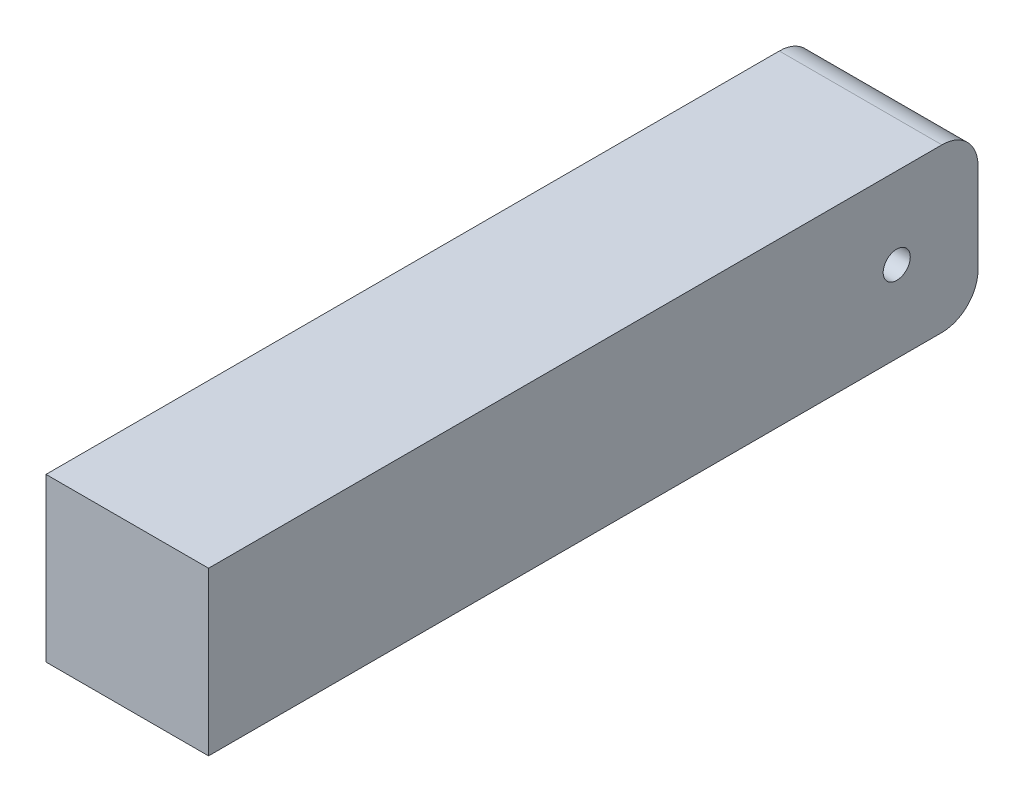
ISO-10303-21;
HEADER;
FILE_DESCRIPTION(('STEP AP214'),'2;1');
FILE_NAME('part.step','',(''),(''),'','','');
FILE_SCHEMA(('AUTOMOTIVE_DESIGN { 1 0 10303 214 1 1 1 1 }'));
ENDSEC;
DATA;
#1=APPLICATION_CONTEXT('core data for automotive mechanical design processes');
#2=APPLICATION_PROTOCOL_DEFINITION('international standard','automotive_design',2000,#1);
#3=PRODUCT_CONTEXT('',#1,'mechanical');
#4=PRODUCT('Part','Part','',(#3));
#5=PRODUCT_RELATED_PRODUCT_CATEGORY('part','',(#4));
#6=PRODUCT_DEFINITION_FORMATION('','',#4);
#7=PRODUCT_DEFINITION_CONTEXT('part definition',#1,'design');
#8=PRODUCT_DEFINITION('design','',#6,#7);
#9=PRODUCT_DEFINITION_SHAPE('','',#8);
#10=(LENGTH_UNIT() NAMED_UNIT(*) SI_UNIT(.MILLI.,.METRE.));
#11=(NAMED_UNIT(*) PLANE_ANGLE_UNIT() SI_UNIT($,.RADIAN.));
#12=(NAMED_UNIT(*) SI_UNIT($,.STERADIAN.) SOLID_ANGLE_UNIT());
#13=UNCERTAINTY_MEASURE_WITH_UNIT(LENGTH_MEASURE(1.E-05),#10,'distance_accuracy_value','');
#14=(GEOMETRIC_REPRESENTATION_CONTEXT(3) GLOBAL_UNCERTAINTY_ASSIGNED_CONTEXT((#13)) GLOBAL_UNIT_ASSIGNED_CONTEXT((#10,
#11,#12)) REPRESENTATION_CONTEXT('',''));
#15=CARTESIAN_POINT('',(0.,0.,0.));
#16=DIRECTION('',(0.,0.,1.));
#17=DIRECTION('',(1.,0.,0.));
#18=AXIS2_PLACEMENT_3D('',#15,#16,#17);
#19=CARTESIAN_POINT('',(18.,9.,-76.2));
#20=DIRECTION('',(-1.,0.,0.));
#21=DIRECTION('',(0.,0.,1.));
#22=AXIS2_PLACEMENT_3D('',#19,#20,#21);
#23=CYLINDRICAL_SURFACE('',#22,1.5);
#24=CARTESIAN_POINT('',(18.,9.,-76.2));
#25=DIRECTION('',(1.,0.,0.));
#26=DIRECTION('',(0.,0.,-1.));
#27=AXIS2_PLACEMENT_3D('',#24,#25,#26);
#28=CIRCLE('',#27,1.5);
#29=CARTESIAN_POINT('',(18.,9.,-77.7));
#30=VERTEX_POINT('',#29);
#31=EDGE_CURVE('E128',#30,#30,#28,.T.);
#32=ORIENTED_EDGE('',*,*,#31,.T.);
#33=EDGE_LOOP('',(#32));
#34=FACE_BOUND('',#33,.T.);
#35=CARTESIAN_POINT('',(8.,9.,-76.2));
#36=DIRECTION('',(-1.,0.,0.));
#37=DIRECTION('',(0.,0.,1.));
#38=AXIS2_PLACEMENT_3D('',#35,#36,#37);
#39=CIRCLE('',#38,1.5);
#40=CARTESIAN_POINT('',(8.,9.,-74.7));
#41=VERTEX_POINT('',#40);
#42=EDGE_CURVE('E126',#41,#41,#39,.T.);
#43=ORIENTED_EDGE('',*,*,#42,.T.);
#44=EDGE_LOOP('',(#43));
#45=FACE_BOUND('',#44,.T.);
#46=ADVANCED_FACE('F43',(#34,#45),#23,.F.);
#47=CARTESIAN_POINT('',(18.,0.,0.));
#48=DIRECTION('',(-1.,0.,0.));
#49=DIRECTION('',(0.,0.,1.));
#50=AXIS2_PLACEMENT_3D('',#47,#48,#49);
#51=PLANE('',#50);
#52=DIRECTION('',(0.,0.,-1.));
#53=VECTOR('',#52,1.);
#54=CARTESIAN_POINT('',(18.,0.,0.));
#55=LINE('',#54,#53);
#56=CARTESIAN_POINT('',(18.,0.,0.));
#57=VERTEX_POINT('',#56);
#58=CARTESIAN_POINT('',(18.,0.,-81.2));
#59=VERTEX_POINT('',#58);
#60=EDGE_CURVE('E96',#57,#59,#55,.T.);
#61=ORIENTED_EDGE('',*,*,#60,.T.);
#62=CARTESIAN_POINT('',(18.,4.,-81.2));
#63=DIRECTION('',(-1.,0.,0.));
#64=DIRECTION('',(0.,0.,1.));
#65=AXIS2_PLACEMENT_3D('',#62,#63,#64);
#66=CIRCLE('',#65,4.);
#67=CARTESIAN_POINT('',(18.,4.,-85.2));
#68=VERTEX_POINT('',#67);
#69=EDGE_CURVE('E51',#59,#68,#66,.F.);
#70=ORIENTED_EDGE('',*,*,#69,.T.);
#71=DIRECTION('',(0.,1.,0.));
#72=VECTOR('',#71,1.);
#73=CARTESIAN_POINT('',(18.,0.,-85.2));
#74=LINE('',#73,#72);
#75=CARTESIAN_POINT('',(18.,14.,-85.2));
#76=VERTEX_POINT('',#75);
#77=EDGE_CURVE('E103',#68,#76,#74,.T.);
#78=ORIENTED_EDGE('',*,*,#77,.T.);
#79=CARTESIAN_POINT('',(18.,14.,-81.2));
#80=DIRECTION('',(-1.,0.,0.));
#81=DIRECTION('',(0.,0.,1.));
#82=AXIS2_PLACEMENT_3D('',#79,#80,#81);
#83=CIRCLE('',#82,4.);
#84=CARTESIAN_POINT('',(18.,18.,-81.2));
#85=VERTEX_POINT('',#84);
#86=EDGE_CURVE('E58',#76,#85,#83,.F.);
#87=ORIENTED_EDGE('',*,*,#86,.T.);
#88=DIRECTION('',(0.,0.,1.));
#89=VECTOR('',#88,1.);
#90=CARTESIAN_POINT('',(18.,18.,0.));
#91=LINE('',#90,#89);
#92=CARTESIAN_POINT('',(18.,18.,0.));
#93=VERTEX_POINT('',#92);
#94=EDGE_CURVE('E109',#85,#93,#91,.T.);
#95=ORIENTED_EDGE('',*,*,#94,.T.);
#96=DIRECTION('',(0.,-1.,0.));
#97=VECTOR('',#96,1.);
#98=CARTESIAN_POINT('',(18.,0.,0.));
#99=LINE('',#98,#97);
#100=EDGE_CURVE('E104',#93,#57,#99,.T.);
#101=ORIENTED_EDGE('',*,*,#100,.T.);
#102=EDGE_LOOP('',(#61,#70,#78,#87,#95,#101));
#103=FACE_BOUND('',#102,.T.);
#104=ORIENTED_EDGE('',*,*,#31,.F.);
#105=EDGE_LOOP('',(#104));
#106=FACE_BOUND('',#105,.T.);
#107=ADVANCED_FACE('F107',(#103,#106),#51,.F.);
#108=CARTESIAN_POINT('',(0.,0.,0.));
#109=DIRECTION('',(-1.,0.,0.));
#110=DIRECTION('',(0.,0.,1.));
#111=AXIS2_PLACEMENT_3D('',#108,#109,#110);
#112=PLANE('',#111);
#113=CARTESIAN_POINT('',(0.,9.,-76.2));
#114=DIRECTION('',(-1.,0.,0.));
#115=DIRECTION('',(0.,0.,1.));
#116=AXIS2_PLACEMENT_3D('',#113,#114,#115);
#117=CIRCLE('',#116,3.00000000000001);
#118=CARTESIAN_POINT('',(0.,9.,-73.2));
#119=VERTEX_POINT('',#118);
#120=EDGE_CURVE('E259',#119,#119,#117,.T.);
#121=ORIENTED_EDGE('',*,*,#120,.F.);
#122=EDGE_LOOP('',(#121));
#123=FACE_BOUND('',#122,.T.);
#124=DIRECTION('',(0.,1.,0.));
#125=VECTOR('',#124,1.);
#126=CARTESIAN_POINT('',(0.,0.,-85.2));
#127=LINE('',#126,#125);
#128=CARTESIAN_POINT('',(0.,4.,-85.2));
#129=VERTEX_POINT('',#128);
#130=CARTESIAN_POINT('',(0.,14.,-85.2));
#131=VERTEX_POINT('',#130);
#132=EDGE_CURVE('E151',#129,#131,#127,.T.);
#133=ORIENTED_EDGE('',*,*,#132,.F.);
#134=CARTESIAN_POINT('',(0.,4.,-81.2));
#135=DIRECTION('',(-1.,0.,0.));
#136=DIRECTION('',(0.,0.,1.));
#137=AXIS2_PLACEMENT_3D('',#134,#135,#136);
#138=CIRCLE('',#137,4.);
#139=CARTESIAN_POINT('',(0.,0.,-81.2));
#140=VERTEX_POINT('',#139);
#141=EDGE_CURVE('E135',#129,#140,#138,.T.);
#142=ORIENTED_EDGE('',*,*,#141,.T.);
#143=DIRECTION('',(0.,0.,-1.));
#144=VECTOR('',#143,1.);
#145=CARTESIAN_POINT('',(0.,0.,0.));
#146=LINE('',#145,#144);
#147=CARTESIAN_POINT('',(0.,0.,0.));
#148=VERTEX_POINT('',#147);
#149=EDGE_CURVE('E150',#148,#140,#146,.T.);
#150=ORIENTED_EDGE('',*,*,#149,.F.);
#151=DIRECTION('',(0.,-1.,0.));
#152=VECTOR('',#151,1.);
#153=CARTESIAN_POINT('',(0.,0.,0.));
#154=LINE('',#153,#152);
#155=CARTESIAN_POINT('',(0.,18.,0.));
#156=VERTEX_POINT('',#155);
#157=EDGE_CURVE('E117',#156,#148,#154,.T.);
#158=ORIENTED_EDGE('',*,*,#157,.F.);
#159=DIRECTION('',(0.,0.,1.));
#160=VECTOR('',#159,1.);
#161=CARTESIAN_POINT('',(0.,18.,0.));
#162=LINE('',#161,#160);
#163=CARTESIAN_POINT('',(0.,18.,-81.2));
#164=VERTEX_POINT('',#163);
#165=EDGE_CURVE('E113',#164,#156,#162,.T.);
#166=ORIENTED_EDGE('',*,*,#165,.F.);
#167=CARTESIAN_POINT('',(0.,14.,-81.2));
#168=DIRECTION('',(-1.,0.,0.));
#169=DIRECTION('',(0.,0.,1.));
#170=AXIS2_PLACEMENT_3D('',#167,#168,#169);
#171=CIRCLE('',#170,4.);
#172=EDGE_CURVE('E133',#164,#131,#171,.T.);
#173=ORIENTED_EDGE('',*,*,#172,.T.);
#174=EDGE_LOOP('',(#133,#142,#150,#158,#166,#173));
#175=FACE_BOUND('',#174,.T.);
#176=ADVANCED_FACE('F149',(#123,#175),#112,.T.);
#177=CARTESIAN_POINT('',(18.,0.,0.));
#178=DIRECTION('',(0.,0.,-1.));
#179=DIRECTION('',(-1.,0.,0.));
#180=AXIS2_PLACEMENT_3D('',#177,#178,#179);
#181=PLANE('',#180);
#182=ORIENTED_EDGE('',*,*,#157,.T.);
#183=DIRECTION('',(-1.,0.,0.));
#184=VECTOR('',#183,1.);
#185=CARTESIAN_POINT('',(18.,0.,0.));
#186=LINE('',#185,#184);
#187=EDGE_CURVE('E100',#57,#148,#186,.T.);
#188=ORIENTED_EDGE('',*,*,#187,.F.);
#189=ORIENTED_EDGE('',*,*,#100,.F.);
#190=DIRECTION('',(-1.,0.,0.));
#191=VECTOR('',#190,1.);
#192=CARTESIAN_POINT('',(18.,18.,0.));
#193=LINE('',#192,#191);
#194=EDGE_CURVE('E119',#93,#156,#193,.T.);
#195=ORIENTED_EDGE('',*,*,#194,.T.);
#196=EDGE_LOOP('',(#182,#188,#189,#195));
#197=FACE_BOUND('',#196,.T.);
#198=ADVANCED_FACE('F115',(#197),#181,.F.);
#199=CARTESIAN_POINT('',(18.,0.,0.));
#200=DIRECTION('',(0.,1.,0.));
#201=DIRECTION('',(0.,0.,1.));
#202=AXIS2_PLACEMENT_3D('',#199,#200,#201);
#203=PLANE('',#202);
#204=ORIENTED_EDGE('',*,*,#149,.T.);
#205=DIRECTION('',(-1.,0.,0.));
#206=VECTOR('',#205,1.);
#207=CARTESIAN_POINT('',(18.,0.,-81.2));
#208=LINE('',#207,#206);
#209=EDGE_CURVE('E66',#140,#59,#208,.F.);
#210=ORIENTED_EDGE('',*,*,#209,.T.);
#211=ORIENTED_EDGE('',*,*,#60,.F.);
#212=ORIENTED_EDGE('',*,*,#187,.T.);
#213=EDGE_LOOP('',(#204,#210,#211,#212));
#214=FACE_BOUND('',#213,.T.);
#215=ADVANCED_FACE('F98',(#214),#203,.F.);
#216=CARTESIAN_POINT('',(18.,0.,-85.2));
#217=DIRECTION('',(0.,0.,1.));
#218=DIRECTION('',(1.,0.,0.));
#219=AXIS2_PLACEMENT_3D('',#216,#217,#218);
#220=PLANE('',#219);
#221=ORIENTED_EDGE('',*,*,#77,.F.);
#222=DIRECTION('',(-1.,0.,0.));
#223=VECTOR('',#222,1.);
#224=CARTESIAN_POINT('',(18.,4.,-85.2));
#225=LINE('',#224,#223);
#226=EDGE_CURVE('E121',#68,#129,#225,.T.);
#227=ORIENTED_EDGE('',*,*,#226,.T.);
#228=ORIENTED_EDGE('',*,*,#132,.T.);
#229=DIRECTION('',(-1.,0.,0.));
#230=VECTOR('',#229,1.);
#231=CARTESIAN_POINT('',(18.,14.,-85.2));
#232=LINE('',#231,#230);
#233=EDGE_CURVE('E118',#131,#76,#232,.F.);
#234=ORIENTED_EDGE('',*,*,#233,.T.);
#235=EDGE_LOOP('',(#221,#227,#228,#234));
#236=FACE_BOUND('',#235,.T.);
#237=ADVANCED_FACE('F142',(#236),#220,.F.);
#238=CARTESIAN_POINT('',(18.,18.,0.));
#239=DIRECTION('',(0.,-1.,0.));
#240=DIRECTION('',(0.,0.,-1.));
#241=AXIS2_PLACEMENT_3D('',#238,#239,#240);
#242=PLANE('',#241);
#243=ORIENTED_EDGE('',*,*,#94,.F.);
#244=DIRECTION('',(-1.,0.,0.));
#245=VECTOR('',#244,1.);
#246=CARTESIAN_POINT('',(18.,18.,-81.2));
#247=LINE('',#246,#245);
#248=EDGE_CURVE('E11',#85,#164,#247,.T.);
#249=ORIENTED_EDGE('',*,*,#248,.T.);
#250=ORIENTED_EDGE('',*,*,#165,.T.);
#251=ORIENTED_EDGE('',*,*,#194,.F.);
#252=EDGE_LOOP('',(#243,#249,#250,#251));
#253=FACE_BOUND('',#252,.T.);
#254=ADVANCED_FACE('F158',(#253),#242,.F.);
#255=CARTESIAN_POINT('',(8.,9.,-76.2));
#256=DIRECTION('',(-1.,0.,0.));
#257=DIRECTION('',(0.,0.,1.));
#258=AXIS2_PLACEMENT_3D('',#255,#256,#257);
#259=CYLINDRICAL_SURFACE('',#258,3.00000000000001);
#260=CARTESIAN_POINT('',(8.,9.,-76.2));
#261=DIRECTION('',(-1.,0.,0.));
#262=DIRECTION('',(0.,0.,1.));
#263=AXIS2_PLACEMENT_3D('',#260,#261,#262);
#264=CIRCLE('',#263,3.00000000000001);
#265=CARTESIAN_POINT('',(8.,9.,-73.2));
#266=VERTEX_POINT('',#265);
#267=EDGE_CURVE('E129',#266,#266,#264,.T.);
#268=ORIENTED_EDGE('',*,*,#267,.F.);
#269=EDGE_LOOP('',(#268));
#270=FACE_BOUND('',#269,.T.);
#271=ORIENTED_EDGE('',*,*,#120,.T.);
#272=EDGE_LOOP('',(#271));
#273=FACE_BOUND('',#272,.T.);
#274=ADVANCED_FACE('F178',(#270,#273),#259,.F.);
#275=CARTESIAN_POINT('',(8.,9.,-76.2));
#276=DIRECTION('',(-1.,0.,0.));
#277=DIRECTION('',(0.,0.,1.));
#278=AXIS2_PLACEMENT_3D('',#275,#276,#277);
#279=PLANE('',#278);
#280=ORIENTED_EDGE('',*,*,#42,.F.);
#281=EDGE_LOOP('',(#280));
#282=FACE_BOUND('',#281,.T.);
#283=ORIENTED_EDGE('',*,*,#267,.T.);
#284=EDGE_LOOP('',(#283));
#285=FACE_BOUND('',#284,.T.);
#286=ADVANCED_FACE('F165',(#282,#285),#279,.T.);
#287=CARTESIAN_POINT('',(18.,4.,-81.2));
#288=DIRECTION('',(-1.,0.,0.));
#289=DIRECTION('',(0.,0.,1.));
#290=AXIS2_PLACEMENT_3D('',#287,#288,#289);
#291=CYLINDRICAL_SURFACE('',#290,4.);
#292=ORIENTED_EDGE('',*,*,#69,.F.);
#293=ORIENTED_EDGE('',*,*,#209,.F.);
#294=ORIENTED_EDGE('',*,*,#141,.F.);
#295=ORIENTED_EDGE('',*,*,#226,.F.);
#296=EDGE_LOOP('',(#292,#293,#294,#295));
#297=FACE_BOUND('',#296,.T.);
#298=ADVANCED_FACE('F147',(#297),#291,.T.);
#299=CARTESIAN_POINT('',(18.,14.,-81.2));
#300=DIRECTION('',(-1.,0.,0.));
#301=DIRECTION('',(0.,0.,1.));
#302=AXIS2_PLACEMENT_3D('',#299,#300,#301);
#303=CYLINDRICAL_SURFACE('',#302,4.);
#304=ORIENTED_EDGE('',*,*,#86,.F.);
#305=ORIENTED_EDGE('',*,*,#233,.F.);
#306=ORIENTED_EDGE('',*,*,#172,.F.);
#307=ORIENTED_EDGE('',*,*,#248,.F.);
#308=EDGE_LOOP('',(#304,#305,#306,#307));
#309=FACE_BOUND('',#308,.T.);
#310=ADVANCED_FACE('F45',(#309),#303,.T.);
#311=CLOSED_SHELL('',(#46,#107,#176,#198,#215,#237,#254,#274,#286,#298,#310));
#312=MANIFOLD_SOLID_BREP('B2',#311);
#313=ADVANCED_BREP_SHAPE_REPRESENTATION('',(#18,#312),#14);
#314=SHAPE_DEFINITION_REPRESENTATION(#9,#313);
ENDSEC;
END-ISO-10303-21;
